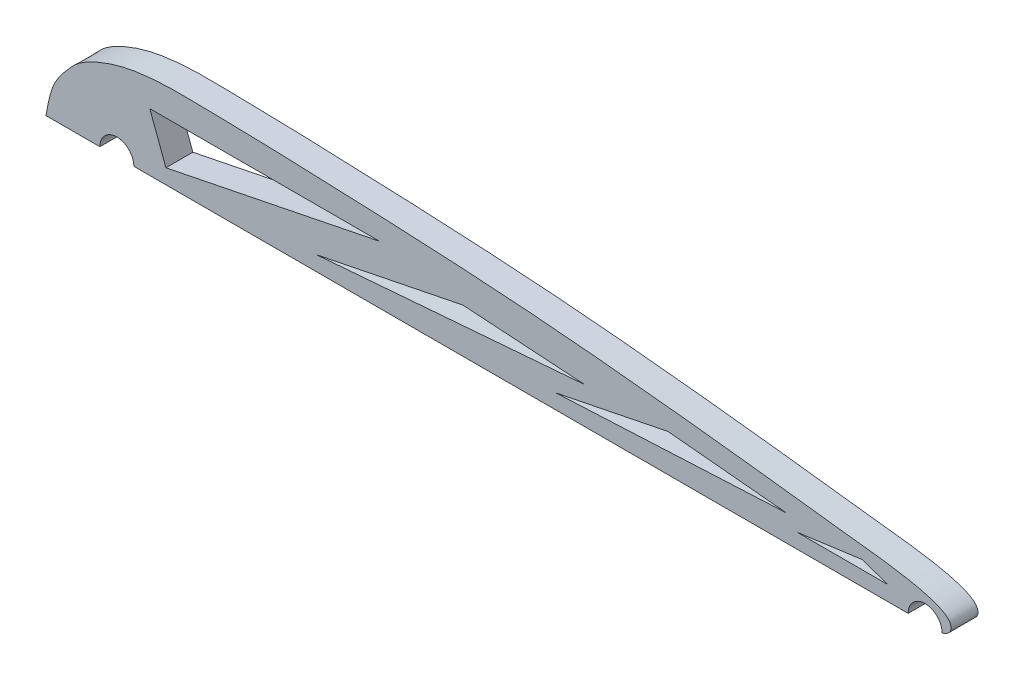
ISO-10303-21;
HEADER;
FILE_DESCRIPTION(('STEP AP214'),'2;1');
FILE_NAME('part.step','',(''),(''),'','','');
FILE_SCHEMA(('AUTOMOTIVE_DESIGN { 1 0 10303 214 1 1 1 1 }'));
ENDSEC;
DATA;
#1=APPLICATION_CONTEXT('core data for automotive mechanical design processes');
#2=APPLICATION_PROTOCOL_DEFINITION('international standard','automotive_design',2000,#1);
#3=PRODUCT_CONTEXT('',#1,'mechanical');
#4=PRODUCT('Part','Part','',(#3));
#5=PRODUCT_RELATED_PRODUCT_CATEGORY('part','',(#4));
#6=PRODUCT_DEFINITION_FORMATION('','',#4);
#7=PRODUCT_DEFINITION_CONTEXT('part definition',#1,'design');
#8=PRODUCT_DEFINITION('design','',#6,#7);
#9=PRODUCT_DEFINITION_SHAPE('','',#8);
#10=(LENGTH_UNIT() NAMED_UNIT(*) SI_UNIT(.MILLI.,.METRE.));
#11=(NAMED_UNIT(*) PLANE_ANGLE_UNIT() SI_UNIT($,.RADIAN.));
#12=(NAMED_UNIT(*) SI_UNIT($,.STERADIAN.) SOLID_ANGLE_UNIT());
#13=UNCERTAINTY_MEASURE_WITH_UNIT(LENGTH_MEASURE(1.E-05),#10,'distance_accuracy_value','');
#14=(GEOMETRIC_REPRESENTATION_CONTEXT(3) GLOBAL_UNCERTAINTY_ASSIGNED_CONTEXT((#13)) GLOBAL_UNIT_ASSIGNED_CONTEXT((#10,
#11,#12)) REPRESENTATION_CONTEXT('',''));
#15=CARTESIAN_POINT('',(0.,0.,0.));
#16=DIRECTION('',(0.,0.,1.));
#17=DIRECTION('',(1.,0.,0.));
#18=AXIS2_PLACEMENT_3D('',#15,#16,#17);
#19=CARTESIAN_POINT('',(14.8610356890417,12.1352375565523,5.));
#20=DIRECTION('',(0.,0.,1.));
#21=DIRECTION('',(1.,0.,0.));
#22=AXIS2_PLACEMENT_3D('',#19,#20,#21);
#23=PLANE('',#22);
#24=CARTESIAN_POINT('',(78.1499999999998,0.,5.));
#25=CARTESIAN_POINT('',(79.7288203575273,0.427224178476418,5.));
#26=CARTESIAN_POINT('',(81.3237199877719,4.87384359321941,5.));
#27=CARTESIAN_POINT('',(64.9906171257157,6.47003645683106,5.));
#28=CARTESIAN_POINT('',(42.9697577180014,9.06999575365193,5.));
#29=CARTESIAN_POINT('',(40.2082908404739,9.57389921274302,5.));
#30=CARTESIAN_POINT('',(10.4925086582751,12.6101721361199,5.));
#31=CARTESIAN_POINT('',(-10.4279332878798,14.3482725689576,5.));
#32=CARTESIAN_POINT('',(-48.1351279676736,15.7694257256182,5.));
#33=CARTESIAN_POINT('',(-61.1396803525049,15.8791381322763,5.));
#34=CARTESIAN_POINT('',(-66.8997810388126,16.2433251523578,5.));
#35=CARTESIAN_POINT('',(-75.9492736005043,14.6151501523316,5.));
#36=CARTESIAN_POINT('',(-81.5993452490482,12.2674547265709,5.));
#37=CARTESIAN_POINT('',(-86.1625850353552,7.09525795875279,5.));
#38=CARTESIAN_POINT('',(-87.2200022655602,5.73835966521686,5.));
#39=CARTESIAN_POINT('',(-88.15,0.,5.));
#40=B_SPLINE_CURVE_WITH_KNOTS('',3,(#24,#25,#26,#27,#28,#29,#30,#31,#32,#33,#34,#35,#36,#37,#38,
#39),.UNSPECIFIED.,.F.,.F.,(4,1,1,1,1,1,1,1,1,1,1,1,1,4),(0.,0.0583812049075519,
0.240524589126218,0.28476183635656,0.456516429980629,0.489994099803233,0.598069210379586,
0.698578605301512,0.721164247859249,0.812507703946103,0.830026929449823,0.878837277392729,
0.896444713797033,1.),.UNSPECIFIED.);
#41=CARTESIAN_POINT('',(78.15,0.,5.));
#42=VERTEX_POINT('',#41);
#43=CARTESIAN_POINT('',(-88.15,0.,5.));
#44=VERTEX_POINT('',#43);
#45=EDGE_CURVE('E251',#42,#44,#40,.T.);
#46=ORIENTED_EDGE('',*,*,#45,.T.);
#47=DIRECTION('',(1.,0.,0.));
#48=VECTOR('',#47,1.);
#49=CARTESIAN_POINT('',(-88.15,0.,5.));
#50=LINE('',#49,#48);
#51=CARTESIAN_POINT('',(-78.15,0.,5.));
#52=VERTEX_POINT('',#51);
#53=EDGE_CURVE('E257',#44,#52,#50,.T.);
#54=ORIENTED_EDGE('',*,*,#53,.T.);
#55=CARTESIAN_POINT('',(-75.,0.,5.));
#56=DIRECTION('',(0.,0.,-1.));
#57=DIRECTION('',(1.,0.,0.));
#58=AXIS2_PLACEMENT_3D('',#55,#56,#57);
#59=CIRCLE('',#58,3.15);
#60=CARTESIAN_POINT('',(-71.85,0.,5.));
#61=VERTEX_POINT('',#60);
#62=EDGE_CURVE('E263',#52,#61,#59,.T.);
#63=ORIENTED_EDGE('',*,*,#62,.T.);
#64=DIRECTION('',(1.,0.,0.));
#65=VECTOR('',#64,1.);
#66=CARTESIAN_POINT('',(-71.85,0.,5.));
#67=LINE('',#66,#65);
#68=CARTESIAN_POINT('',(71.85,0.,5.));
#69=VERTEX_POINT('',#68);
#70=EDGE_CURVE('E265',#61,#69,#67,.T.);
#71=ORIENTED_EDGE('',*,*,#70,.T.);
#72=CARTESIAN_POINT('',(75.,0.,5.));
#73=DIRECTION('',(0.,0.,-1.));
#74=DIRECTION('',(1.,0.,0.));
#75=AXIS2_PLACEMENT_3D('',#72,#73,#74);
#76=CIRCLE('',#75,3.15);
#77=EDGE_CURVE('E267',#69,#42,#76,.T.);
#78=ORIENTED_EDGE('',*,*,#77,.T.);
#79=EDGE_LOOP('',(#46,#54,#63,#71,#78));
#80=FACE_BOUND('',#79,.T.);
#81=DIRECTION('',(0.349847585913174,-0.936806632465166,0.));
#82=VECTOR('',#81,1.);
#83=CARTESIAN_POINT('',(-68.8935229566758,10.7598307033702,5.));
#84=LINE('',#83,#82);
#85=CARTESIAN_POINT('',(-68.8935229566758,10.7598307033702,5.));
#86=VERTEX_POINT('',#85);
#87=CARTESIAN_POINT('',(-65.8996184008828,2.7428834447127,5.));
#88=VERTEX_POINT('',#87);
#89=EDGE_CURVE('E230',#86,#88,#84,.T.);
#90=ORIENTED_EDGE('',*,*,#89,.F.);
#91=DIRECTION('',(-1.,0.,0.));
#92=VECTOR('',#91,1.);
#93=CARTESIAN_POINT('',(-26.2303830366254,10.7598307033702,5.));
#94=LINE('',#93,#92);
#95=CARTESIAN_POINT('',(-26.2303830366254,10.7598307033702,5.));
#96=VERTEX_POINT('',#95);
#97=EDGE_CURVE('E228',#96,#86,#94,.T.);
#98=ORIENTED_EDGE('',*,*,#97,.F.);
#99=DIRECTION('',(0.980183819704337,0.198090079483594,0.));
#100=VECTOR('',#99,1.);
#101=CARTESIAN_POINT('',(-65.8996184008828,2.7428834447127,5.));
#102=LINE('',#101,#100);
#103=EDGE_CURVE('E234',#88,#96,#102,.T.);
#104=ORIENTED_EDGE('',*,*,#103,.F.);
#105=EDGE_LOOP('',(#90,#98,#104));
#106=FACE_BOUND('',#105,.T.);
#107=DIRECTION('',(-0.99785604327123,0.0654470542277074,0.));
#108=VECTOR('',#107,1.);
#109=CARTESIAN_POINT('',(-10.7862147771477,8.2338593987021,5.));
#110=LINE('',#109,#108);
#111=CARTESIAN_POINT('',(11.8171540265773,6.75135707404146,5.));
#112=VERTEX_POINT('',#111);
#113=CARTESIAN_POINT('',(-10.7862147771477,8.2338593987021,5.));
#114=VERTEX_POINT('',#113);
#115=EDGE_CURVE('E206',#112,#114,#110,.T.);
#116=ORIENTED_EDGE('',*,*,#115,.F.);
#117=DIRECTION('',(0.996772824585682,0.0802741313717004,0.));
#118=VECTOR('',#117,1.);
#119=CARTESIAN_POINT('',(11.8171540265773,6.75135707404146,5.));
#120=LINE('',#119,#118);
#121=CARTESIAN_POINT('',(-37.9565092134814,2.7428834447127,5.));
#122=VERTEX_POINT('',#121);
#123=EDGE_CURVE('E204',#122,#112,#120,.T.);
#124=ORIENTED_EDGE('',*,*,#123,.F.);
#125=DIRECTION('',(-0.980183819704337,-0.198090079483594,0.));
#126=VECTOR('',#125,1.);
#127=CARTESIAN_POINT('',(-37.9565092134814,2.7428834447127,5.));
#128=LINE('',#127,#126);
#129=EDGE_CURVE('E210',#114,#122,#128,.T.);
#130=ORIENTED_EDGE('',*,*,#129,.F.);
#131=EDGE_LOOP('',(#116,#124,#130));
#132=FACE_BOUND('',#131,.T.);
#133=DIRECTION('',(-0.995451385128616,0.095270876166429,0.));
#134=VECTOR('',#133,1.);
#135=CARTESIAN_POINT('',(27.2662435771487,6.94911714167267,5.));
#136=LINE('',#135,#134);
#137=CARTESIAN_POINT('',(49.2409609739899,4.84600029319268,5.));
#138=VERTEX_POINT('',#137);
#139=CARTESIAN_POINT('',(27.2662435771487,6.94911714167267,5.));
#140=VERTEX_POINT('',#139);
#141=EDGE_CURVE('E182',#138,#140,#136,.T.);
#142=ORIENTED_EDGE('',*,*,#141,.F.);
#143=DIRECTION('',(0.998794217155936,0.0490928892596631,0.));
#144=VECTOR('',#143,1.);
#145=CARTESIAN_POINT('',(49.2409609739899,4.84600029319268,5.));
#146=LINE('',#145,#144);
#147=CARTESIAN_POINT('',(6.45307503078155,2.7428834447127,5.));
#148=VERTEX_POINT('',#147);
#149=EDGE_CURVE('E180',#148,#138,#146,.T.);
#150=ORIENTED_EDGE('',*,*,#149,.F.);
#151=DIRECTION('',(-0.980183819704337,-0.198090079483594,0.));
#152=VECTOR('',#151,1.);
#153=CARTESIAN_POINT('',(6.45307503078155,2.7428834447127,5.));
#154=LINE('',#153,#152);
#155=EDGE_CURVE('E186',#140,#148,#154,.T.);
#156=ORIENTED_EDGE('',*,*,#155,.F.);
#157=EDGE_LOOP('',(#142,#150,#156));
#158=FACE_BOUND('',#157,.T.);
#159=DIRECTION('',(-0.946331107992416,0.32319875316258,0.));
#160=VECTOR('',#159,1.);
#161=CARTESIAN_POINT('',(63.2976090040538,4.38617694027919,5.));
#162=LINE('',#161,#160);
#163=CARTESIAN_POINT('',(68.1091985884786,2.7428834447127,5.));
#164=VERTEX_POINT('',#163);
#165=CARTESIAN_POINT('',(63.2976090040538,4.38617694027919,5.));
#166=VERTEX_POINT('',#165);
#167=EDGE_CURVE('E161',#164,#166,#162,.T.);
#168=ORIENTED_EDGE('',*,*,#167,.F.);
#169=DIRECTION('',(1.,0.,0.));
#170=VECTOR('',#169,1.);
#171=CARTESIAN_POINT('',(68.1091985884786,2.7428834447127,5.));
#172=LINE('',#171,#170);
#173=CARTESIAN_POINT('',(51.2686350429916,2.7428834447127,5.));
#174=VERTEX_POINT('',#173);
#175=EDGE_CURVE('E153',#174,#164,#172,.T.);
#176=ORIENTED_EDGE('',*,*,#175,.F.);
#177=DIRECTION('',(-0.990797291137171,-0.135354083334207,0.));
#178=VECTOR('',#177,1.);
#179=CARTESIAN_POINT('',(51.2686350429916,2.7428834447127,5.));
#180=LINE('',#179,#178);
#181=EDGE_CURVE('E170',#166,#174,#180,.T.);
#182=ORIENTED_EDGE('',*,*,#181,.F.);
#183=EDGE_LOOP('',(#168,#176,#182));
#184=FACE_BOUND('',#183,.T.);
#185=ADVANCED_FACE('F33',(#80,#106,#132,#158,#184),#23,.T.);
#186=CARTESIAN_POINT('',(14.8610356890417,12.1352375565523,0.));
#187=DIRECTION('',(0.,0.,1.));
#188=DIRECTION('',(1.,0.,0.));
#189=AXIS2_PLACEMENT_3D('',#186,#187,#188);
#190=PLANE('',#189);
#191=DIRECTION('',(0.998794217155936,0.0490928892596631,0.));
#192=VECTOR('',#191,1.);
#193=CARTESIAN_POINT('',(49.2409609739899,4.84600029319268,0.));
#194=LINE('',#193,#192);
#195=CARTESIAN_POINT('',(6.45307503078155,2.7428834447127,0.));
#196=VERTEX_POINT('',#195);
#197=CARTESIAN_POINT('',(49.2409609739899,4.84600029319268,0.));
#198=VERTEX_POINT('',#197);
#199=EDGE_CURVE('E168',#196,#198,#194,.T.);
#200=ORIENTED_EDGE('',*,*,#199,.T.);
#201=DIRECTION('',(-0.995451385128616,0.095270876166429,0.));
#202=VECTOR('',#201,1.);
#203=CARTESIAN_POINT('',(27.2662435771487,6.94911714167267,0.));
#204=LINE('',#203,#202);
#205=CARTESIAN_POINT('',(27.2662435771487,6.94911714167267,0.));
#206=VERTEX_POINT('',#205);
#207=EDGE_CURVE('E191',#198,#206,#204,.T.);
#208=ORIENTED_EDGE('',*,*,#207,.T.);
#209=DIRECTION('',(-0.980183819704337,-0.198090079483594,0.));
#210=VECTOR('',#209,1.);
#211=CARTESIAN_POINT('',(6.45307503078155,2.7428834447127,0.));
#212=LINE('',#211,#210);
#213=EDGE_CURVE('E183',#206,#196,#212,.T.);
#214=ORIENTED_EDGE('',*,*,#213,.T.);
#215=EDGE_LOOP('',(#200,#208,#214));
#216=FACE_BOUND('',#215,.T.);
#217=DIRECTION('',(-1.,0.,0.));
#218=VECTOR('',#217,1.);
#219=CARTESIAN_POINT('',(-26.2303830366254,10.7598307033702,0.));
#220=LINE('',#219,#218);
#221=CARTESIAN_POINT('',(-26.2303830366254,10.7598307033702,0.));
#222=VERTEX_POINT('',#221);
#223=CARTESIAN_POINT('',(-68.8935229566758,10.7598307033702,0.));
#224=VERTEX_POINT('',#223);
#225=EDGE_CURVE('E227',#222,#224,#220,.T.);
#226=ORIENTED_EDGE('',*,*,#225,.T.);
#227=DIRECTION('',(0.349847585913174,-0.936806632465166,0.));
#228=VECTOR('',#227,1.);
#229=CARTESIAN_POINT('',(-68.8935229566758,10.7598307033702,0.));
#230=LINE('',#229,#228);
#231=CARTESIAN_POINT('',(-65.8996184008828,2.7428834447127,0.));
#232=VERTEX_POINT('',#231);
#233=EDGE_CURVE('E239',#224,#232,#230,.T.);
#234=ORIENTED_EDGE('',*,*,#233,.T.);
#235=DIRECTION('',(0.980183819704337,0.198090079483594,0.));
#236=VECTOR('',#235,1.);
#237=CARTESIAN_POINT('',(-65.8996184008828,2.7428834447127,0.));
#238=LINE('',#237,#236);
#239=EDGE_CURVE('E231',#232,#222,#238,.T.);
#240=ORIENTED_EDGE('',*,*,#239,.T.);
#241=EDGE_LOOP('',(#226,#234,#240));
#242=FACE_BOUND('',#241,.T.);
#243=CARTESIAN_POINT('',(78.1499999999998,0.,0.));
#244=CARTESIAN_POINT('',(79.7288203575273,0.427224178476418,0.));
#245=CARTESIAN_POINT('',(81.3237199877719,4.87384359321941,0.));
#246=CARTESIAN_POINT('',(64.9906171257157,6.47003645683106,0.));
#247=CARTESIAN_POINT('',(42.9697577180014,9.06999575365193,0.));
#248=CARTESIAN_POINT('',(40.2082908404739,9.57389921274302,0.));
#249=CARTESIAN_POINT('',(10.4925086582751,12.6101721361199,0.));
#250=CARTESIAN_POINT('',(-10.4279332878798,14.3482725689576,0.));
#251=CARTESIAN_POINT('',(-48.1351279676736,15.7694257256182,0.));
#252=CARTESIAN_POINT('',(-61.1396803525049,15.8791381322763,0.));
#253=CARTESIAN_POINT('',(-66.8997810388126,16.2433251523578,0.));
#254=CARTESIAN_POINT('',(-75.9492736005043,14.6151501523316,0.));
#255=CARTESIAN_POINT('',(-81.5993452490482,12.2674547265709,0.));
#256=CARTESIAN_POINT('',(-86.1625850353552,7.09525795875279,0.));
#257=CARTESIAN_POINT('',(-87.2200022655602,5.73835966521686,0.));
#258=CARTESIAN_POINT('',(-88.15,0.,0.));
#259=B_SPLINE_CURVE_WITH_KNOTS('',3,(#243,#244,#245,#246,#247,#248,#249,#250,#251,#252,#253,
#254,#255,#256,#257,#258),.UNSPECIFIED.,.F.,.F.,(4,1,1,1,1,1,1,1,1,1,1,1,1,4),(0.,
0.0583812049075519,0.240524589126218,0.28476183635656,0.456516429980629,0.489994099803233,
0.598069210379586,0.698578605301512,0.721164247859249,0.812507703946103,0.830026929449823,
0.878837277392729,0.896444713797033,1.),.UNSPECIFIED.);
#260=CARTESIAN_POINT('',(78.15,0.,0.));
#261=VERTEX_POINT('',#260);
#262=CARTESIAN_POINT('',(-88.15,0.,0.));
#263=VERTEX_POINT('',#262);
#264=EDGE_CURVE('E250',#261,#263,#259,.T.);
#265=ORIENTED_EDGE('',*,*,#264,.F.);
#266=CARTESIAN_POINT('',(75.,0.,0.));
#267=DIRECTION('',(0.,0.,-1.));
#268=DIRECTION('',(1.,0.,0.));
#269=AXIS2_PLACEMENT_3D('',#266,#267,#268);
#270=CIRCLE('',#269,3.15);
#271=CARTESIAN_POINT('',(71.85,0.,0.));
#272=VERTEX_POINT('',#271);
#273=EDGE_CURVE('E258',#272,#261,#270,.T.);
#274=ORIENTED_EDGE('',*,*,#273,.F.);
#275=DIRECTION('',(1.,0.,0.));
#276=VECTOR('',#275,1.);
#277=CARTESIAN_POINT('',(-71.85,0.,0.));
#278=LINE('',#277,#276);
#279=CARTESIAN_POINT('',(-71.85,0.,0.));
#280=VERTEX_POINT('',#279);
#281=EDGE_CURVE('E281',#280,#272,#278,.T.);
#282=ORIENTED_EDGE('',*,*,#281,.F.);
#283=CARTESIAN_POINT('',(-75.,0.,0.));
#284=DIRECTION('',(0.,0.,-1.));
#285=DIRECTION('',(1.,0.,0.));
#286=AXIS2_PLACEMENT_3D('',#283,#284,#285);
#287=CIRCLE('',#286,3.15);
#288=CARTESIAN_POINT('',(-78.15,0.,0.));
#289=VERTEX_POINT('',#288);
#290=EDGE_CURVE('E279',#289,#280,#287,.T.);
#291=ORIENTED_EDGE('',*,*,#290,.F.);
#292=DIRECTION('',(1.,0.,0.));
#293=VECTOR('',#292,1.);
#294=CARTESIAN_POINT('',(-88.15,0.,0.));
#295=LINE('',#294,#293);
#296=EDGE_CURVE('E274',#263,#289,#295,.T.);
#297=ORIENTED_EDGE('',*,*,#296,.F.);
#298=EDGE_LOOP('',(#265,#274,#282,#291,#297));
#299=FACE_BOUND('',#298,.T.);
#300=DIRECTION('',(0.996772824585682,0.0802741313717004,0.));
#301=VECTOR('',#300,1.);
#302=CARTESIAN_POINT('',(11.8171540265773,6.75135707404146,0.));
#303=LINE('',#302,#301);
#304=CARTESIAN_POINT('',(-37.9565092134814,2.7428834447127,0.));
#305=VERTEX_POINT('',#304);
#306=CARTESIAN_POINT('',(11.8171540265773,6.75135707404146,0.));
#307=VERTEX_POINT('',#306);
#308=EDGE_CURVE('E203',#305,#307,#303,.T.);
#309=ORIENTED_EDGE('',*,*,#308,.T.);
#310=DIRECTION('',(-0.99785604327123,0.0654470542277074,0.));
#311=VECTOR('',#310,1.);
#312=CARTESIAN_POINT('',(-10.7862147771477,8.2338593987021,0.));
#313=LINE('',#312,#311);
#314=CARTESIAN_POINT('',(-10.7862147771477,8.2338593987021,0.));
#315=VERTEX_POINT('',#314);
#316=EDGE_CURVE('E215',#307,#315,#313,.T.);
#317=ORIENTED_EDGE('',*,*,#316,.T.);
#318=DIRECTION('',(-0.980183819704337,-0.198090079483594,0.));
#319=VECTOR('',#318,1.);
#320=CARTESIAN_POINT('',(-37.9565092134814,2.7428834447127,0.));
#321=LINE('',#320,#319);
#322=EDGE_CURVE('E207',#315,#305,#321,.T.);
#323=ORIENTED_EDGE('',*,*,#322,.T.);
#324=EDGE_LOOP('',(#309,#317,#323));
#325=FACE_BOUND('',#324,.T.);
#326=DIRECTION('',(1.,0.,0.));
#327=VECTOR('',#326,1.);
#328=CARTESIAN_POINT('',(68.1091985884786,2.7428834447127,0.));
#329=LINE('',#328,#327);
#330=CARTESIAN_POINT('',(51.2686350429916,2.7428834447127,0.));
#331=VERTEX_POINT('',#330);
#332=CARTESIAN_POINT('',(68.1091985884786,2.7428834447127,0.));
#333=VERTEX_POINT('',#332);
#334=EDGE_CURVE('E57',#331,#333,#329,.T.);
#335=ORIENTED_EDGE('',*,*,#334,.T.);
#336=DIRECTION('',(-0.946331107992416,0.32319875316258,0.));
#337=VECTOR('',#336,1.);
#338=CARTESIAN_POINT('',(63.2976090040538,4.38617694027919,0.));
#339=LINE('',#338,#337);
#340=CARTESIAN_POINT('',(63.2976090040538,4.38617694027919,0.));
#341=VERTEX_POINT('',#340);
#342=EDGE_CURVE('E167',#333,#341,#339,.T.);
#343=ORIENTED_EDGE('',*,*,#342,.T.);
#344=DIRECTION('',(-0.990797291137171,-0.135354083334207,0.));
#345=VECTOR('',#344,1.);
#346=CARTESIAN_POINT('',(51.2686350429916,2.7428834447127,0.));
#347=LINE('',#346,#345);
#348=EDGE_CURVE('E162',#341,#331,#347,.T.);
#349=ORIENTED_EDGE('',*,*,#348,.T.);
#350=EDGE_LOOP('',(#335,#343,#349));
#351=FACE_BOUND('',#350,.T.);
#352=ADVANCED_FACE('F302',(#216,#242,#299,#325,#351),#190,.F.);
#353=DIRECTION('',(0.,0.,-1.));
#354=VECTOR('',#353,1.);
#355=SURFACE_OF_LINEAR_EXTRUSION('',#40,#354);
#356=ORIENTED_EDGE('',*,*,#264,.T.);
#357=DIRECTION('',(0.,0.,-1.));
#358=VECTOR('',#357,1.);
#359=CARTESIAN_POINT('',(-88.15,0.,5.));
#360=LINE('',#359,#358);
#361=EDGE_CURVE('E11',#44,#263,#360,.T.);
#362=ORIENTED_EDGE('',*,*,#361,.F.);
#363=ORIENTED_EDGE('',*,*,#45,.F.);
#364=DIRECTION('',(0.,0.,-1.));
#365=VECTOR('',#364,1.);
#366=CARTESIAN_POINT('',(78.15,0.,5.));
#367=LINE('',#366,#365);
#368=EDGE_CURVE('E269',#42,#261,#367,.T.);
#369=ORIENTED_EDGE('',*,*,#368,.T.);
#370=EDGE_LOOP('',(#356,#362,#363,#369));
#371=FACE_BOUND('',#370,.T.);
#372=ADVANCED_FACE('F35',(#371),#355,.F.);
#373=CARTESIAN_POINT('',(-88.15,0.,5.));
#374=DIRECTION('',(0.,1.,0.));
#375=DIRECTION('',(0.,0.,1.));
#376=AXIS2_PLACEMENT_3D('',#373,#374,#375);
#377=PLANE('',#376);
#378=ORIENTED_EDGE('',*,*,#296,.T.);
#379=DIRECTION('',(0.,0.,-1.));
#380=VECTOR('',#379,1.);
#381=CARTESIAN_POINT('',(-78.15,0.,5.));
#382=LINE('',#381,#380);
#383=EDGE_CURVE('E42',#52,#289,#382,.T.);
#384=ORIENTED_EDGE('',*,*,#383,.F.);
#385=ORIENTED_EDGE('',*,*,#53,.F.);
#386=ORIENTED_EDGE('',*,*,#361,.T.);
#387=EDGE_LOOP('',(#378,#384,#385,#386));
#388=FACE_BOUND('',#387,.T.);
#389=ADVANCED_FACE('F317',(#388),#377,.F.);
#390=CARTESIAN_POINT('',(-75.,0.,5.));
#391=DIRECTION('',(0.,0.,-1.));
#392=DIRECTION('',(-1.,0.,0.));
#393=AXIS2_PLACEMENT_3D('',#390,#391,#392);
#394=CYLINDRICAL_SURFACE('',#393,3.15);
#395=ORIENTED_EDGE('',*,*,#290,.T.);
#396=DIRECTION('',(0.,0.,-1.));
#397=VECTOR('',#396,1.);
#398=CARTESIAN_POINT('',(-71.85,0.,5.));
#399=LINE('',#398,#397);
#400=EDGE_CURVE('E289',#61,#280,#399,.T.);
#401=ORIENTED_EDGE('',*,*,#400,.F.);
#402=ORIENTED_EDGE('',*,*,#62,.F.);
#403=ORIENTED_EDGE('',*,*,#383,.T.);
#404=EDGE_LOOP('',(#395,#401,#402,#403));
#405=FACE_BOUND('',#404,.T.);
#406=ADVANCED_FACE('F296',(#405),#394,.F.);
#407=CARTESIAN_POINT('',(-71.85,0.,5.));
#408=DIRECTION('',(0.,1.,0.));
#409=DIRECTION('',(0.,0.,1.));
#410=AXIS2_PLACEMENT_3D('',#407,#408,#409);
#411=PLANE('',#410);
#412=ORIENTED_EDGE('',*,*,#281,.T.);
#413=DIRECTION('',(0.,0.,-1.));
#414=VECTOR('',#413,1.);
#415=CARTESIAN_POINT('',(71.85,0.,5.));
#416=LINE('',#415,#414);
#417=EDGE_CURVE('E286',#69,#272,#416,.T.);
#418=ORIENTED_EDGE('',*,*,#417,.F.);
#419=ORIENTED_EDGE('',*,*,#70,.F.);
#420=ORIENTED_EDGE('',*,*,#400,.T.);
#421=EDGE_LOOP('',(#412,#418,#419,#420));
#422=FACE_BOUND('',#421,.T.);
#423=ADVANCED_FACE('F307',(#422),#411,.F.);
#424=CARTESIAN_POINT('',(75.,0.,5.));
#425=DIRECTION('',(0.,0.,-1.));
#426=DIRECTION('',(-1.,0.,0.));
#427=AXIS2_PLACEMENT_3D('',#424,#425,#426);
#428=CYLINDRICAL_SURFACE('',#427,3.15);
#429=ORIENTED_EDGE('',*,*,#273,.T.);
#430=ORIENTED_EDGE('',*,*,#368,.F.);
#431=ORIENTED_EDGE('',*,*,#77,.F.);
#432=ORIENTED_EDGE('',*,*,#417,.T.);
#433=EDGE_LOOP('',(#429,#430,#431,#432));
#434=FACE_BOUND('',#433,.T.);
#435=ADVANCED_FACE('F311',(#434),#428,.F.);
#436=CARTESIAN_POINT('',(-26.2303830366254,10.7598307033702,5.));
#437=DIRECTION('',(0.,-1.,0.));
#438=DIRECTION('',(0.,0.,-1.));
#439=AXIS2_PLACEMENT_3D('',#436,#437,#438);
#440=PLANE('',#439);
#441=ORIENTED_EDGE('',*,*,#225,.F.);
#442=DIRECTION('',(0.,0.,-1.));
#443=VECTOR('',#442,1.);
#444=CARTESIAN_POINT('',(-26.2303830366254,10.7598307033702,5.));
#445=LINE('',#444,#443);
#446=EDGE_CURVE('E236',#96,#222,#445,.T.);
#447=ORIENTED_EDGE('',*,*,#446,.F.);
#448=ORIENTED_EDGE('',*,*,#97,.T.);
#449=DIRECTION('',(0.,0.,-1.));
#450=VECTOR('',#449,1.);
#451=CARTESIAN_POINT('',(-68.8935229566758,10.7598307033702,5.));
#452=LINE('',#451,#450);
#453=EDGE_CURVE('E248',#86,#224,#452,.T.);
#454=ORIENTED_EDGE('',*,*,#453,.T.);
#455=EDGE_LOOP('',(#441,#447,#448,#454));
#456=FACE_BOUND('',#455,.T.);
#457=ADVANCED_FACE('F331',(#456),#440,.T.);
#458=CARTESIAN_POINT('',(-68.8935229566758,10.7598307033702,5.));
#459=DIRECTION('',(0.936806632465166,0.349847585913174,0.));
#460=DIRECTION('',(-0.349847585913174,0.936806632465166,0.));
#461=AXIS2_PLACEMENT_3D('',#458,#459,#460);
#462=PLANE('',#461);
#463=ORIENTED_EDGE('',*,*,#233,.F.);
#464=ORIENTED_EDGE('',*,*,#453,.F.);
#465=ORIENTED_EDGE('',*,*,#89,.T.);
#466=DIRECTION('',(0.,0.,-1.));
#467=VECTOR('',#466,1.);
#468=CARTESIAN_POINT('',(-65.8996184008828,2.7428834447127,5.));
#469=LINE('',#468,#467);
#470=EDGE_CURVE('E246',#88,#232,#469,.T.);
#471=ORIENTED_EDGE('',*,*,#470,.T.);
#472=EDGE_LOOP('',(#463,#464,#465,#471));
#473=FACE_BOUND('',#472,.T.);
#474=ADVANCED_FACE('F357',(#473),#462,.T.);
#475=CARTESIAN_POINT('',(-65.8996184008828,2.7428834447127,5.));
#476=DIRECTION('',(-0.198090079483594,0.980183819704337,0.));
#477=DIRECTION('',(-0.980183819704337,-0.198090079483594,0.));
#478=AXIS2_PLACEMENT_3D('',#475,#476,#477);
#479=PLANE('',#478);
#480=ORIENTED_EDGE('',*,*,#239,.F.);
#481=ORIENTED_EDGE('',*,*,#470,.F.);
#482=ORIENTED_EDGE('',*,*,#103,.T.);
#483=ORIENTED_EDGE('',*,*,#446,.T.);
#484=EDGE_LOOP('',(#480,#481,#482,#483));
#485=FACE_BOUND('',#484,.T.);
#486=ADVANCED_FACE('F364',(#485),#479,.T.);
#487=CARTESIAN_POINT('',(11.8171540265773,6.75135707404146,5.));
#488=DIRECTION('',(-0.0802741313717004,0.996772824585682,0.));
#489=DIRECTION('',(-0.996772824585682,-0.0802741313717004,0.));
#490=AXIS2_PLACEMENT_3D('',#487,#488,#489);
#491=PLANE('',#490);
#492=ORIENTED_EDGE('',*,*,#308,.F.);
#493=DIRECTION('',(0.,0.,-1.));
#494=VECTOR('',#493,1.);
#495=CARTESIAN_POINT('',(-37.9565092134814,2.7428834447127,5.));
#496=LINE('',#495,#494);
#497=EDGE_CURVE('E212',#122,#305,#496,.T.);
#498=ORIENTED_EDGE('',*,*,#497,.F.);
#499=ORIENTED_EDGE('',*,*,#123,.T.);
#500=DIRECTION('',(0.,0.,-1.));
#501=VECTOR('',#500,1.);
#502=CARTESIAN_POINT('',(11.8171540265773,6.75135707404146,5.));
#503=LINE('',#502,#501);
#504=EDGE_CURVE('E224',#112,#307,#503,.T.);
#505=ORIENTED_EDGE('',*,*,#504,.T.);
#506=EDGE_LOOP('',(#492,#498,#499,#505));
#507=FACE_BOUND('',#506,.T.);
#508=ADVANCED_FACE('F371',(#507),#491,.T.);
#509=CARTESIAN_POINT('',(-10.7862147771477,8.2338593987021,5.));
#510=DIRECTION('',(-0.0654470542277074,-0.99785604327123,0.));
#511=DIRECTION('',(0.99785604327123,-0.0654470542277074,0.));
#512=AXIS2_PLACEMENT_3D('',#509,#510,#511);
#513=PLANE('',#512);
#514=ORIENTED_EDGE('',*,*,#316,.F.);
#515=ORIENTED_EDGE('',*,*,#504,.F.);
#516=ORIENTED_EDGE('',*,*,#115,.T.);
#517=DIRECTION('',(0.,0.,-1.));
#518=VECTOR('',#517,1.);
#519=CARTESIAN_POINT('',(-10.7862147771477,8.2338593987021,5.));
#520=LINE('',#519,#518);
#521=EDGE_CURVE('E222',#114,#315,#520,.T.);
#522=ORIENTED_EDGE('',*,*,#521,.T.);
#523=EDGE_LOOP('',(#514,#515,#516,#522));
#524=FACE_BOUND('',#523,.T.);
#525=ADVANCED_FACE('F379',(#524),#513,.T.);
#526=CARTESIAN_POINT('',(-37.9565092134814,2.7428834447127,5.));
#527=DIRECTION('',(0.198090079483594,-0.980183819704337,0.));
#528=DIRECTION('',(0.980183819704337,0.198090079483594,0.));
#529=AXIS2_PLACEMENT_3D('',#526,#527,#528);
#530=PLANE('',#529);
#531=ORIENTED_EDGE('',*,*,#322,.F.);
#532=ORIENTED_EDGE('',*,*,#521,.F.);
#533=ORIENTED_EDGE('',*,*,#129,.T.);
#534=ORIENTED_EDGE('',*,*,#497,.T.);
#535=EDGE_LOOP('',(#531,#532,#533,#534));
#536=FACE_BOUND('',#535,.T.);
#537=ADVANCED_FACE('F387',(#536),#530,.T.);
#538=CARTESIAN_POINT('',(49.2409609739899,4.84600029319268,5.));
#539=DIRECTION('',(-0.0490928892596631,0.998794217155936,0.));
#540=DIRECTION('',(-0.998794217155936,-0.0490928892596631,0.));
#541=AXIS2_PLACEMENT_3D('',#538,#539,#540);
#542=PLANE('',#541);
#543=ORIENTED_EDGE('',*,*,#199,.F.);
#544=DIRECTION('',(0.,0.,-1.));
#545=VECTOR('',#544,1.);
#546=CARTESIAN_POINT('',(6.45307503078155,2.7428834447127,5.));
#547=LINE('',#546,#545);
#548=EDGE_CURVE('E188',#148,#196,#547,.T.);
#549=ORIENTED_EDGE('',*,*,#548,.F.);
#550=ORIENTED_EDGE('',*,*,#149,.T.);
#551=DIRECTION('',(0.,0.,-1.));
#552=VECTOR('',#551,1.);
#553=CARTESIAN_POINT('',(49.2409609739899,4.84600029319268,5.));
#554=LINE('',#553,#552);
#555=EDGE_CURVE('E200',#138,#198,#554,.T.);
#556=ORIENTED_EDGE('',*,*,#555,.T.);
#557=EDGE_LOOP('',(#543,#549,#550,#556));
#558=FACE_BOUND('',#557,.T.);
#559=ADVANCED_FACE('F395',(#558),#542,.T.);
#560=CARTESIAN_POINT('',(27.2662435771487,6.94911714167267,5.));
#561=DIRECTION('',(-0.095270876166429,-0.995451385128616,0.));
#562=DIRECTION('',(0.995451385128616,-0.095270876166429,0.));
#563=AXIS2_PLACEMENT_3D('',#560,#561,#562);
#564=PLANE('',#563);
#565=ORIENTED_EDGE('',*,*,#207,.F.);
#566=ORIENTED_EDGE('',*,*,#555,.F.);
#567=ORIENTED_EDGE('',*,*,#141,.T.);
#568=DIRECTION('',(0.,0.,-1.));
#569=VECTOR('',#568,1.);
#570=CARTESIAN_POINT('',(27.2662435771487,6.94911714167267,5.));
#571=LINE('',#570,#569);
#572=EDGE_CURVE('E198',#140,#206,#571,.T.);
#573=ORIENTED_EDGE('',*,*,#572,.T.);
#574=EDGE_LOOP('',(#565,#566,#567,#573));
#575=FACE_BOUND('',#574,.T.);
#576=ADVANCED_FACE('F403',(#575),#564,.T.);
#577=CARTESIAN_POINT('',(6.45307503078155,2.7428834447127,5.));
#578=DIRECTION('',(0.198090079483594,-0.980183819704337,0.));
#579=DIRECTION('',(0.980183819704337,0.198090079483594,0.));
#580=AXIS2_PLACEMENT_3D('',#577,#578,#579);
#581=PLANE('',#580);
#582=ORIENTED_EDGE('',*,*,#213,.F.);
#583=ORIENTED_EDGE('',*,*,#572,.F.);
#584=ORIENTED_EDGE('',*,*,#155,.T.);
#585=ORIENTED_EDGE('',*,*,#548,.T.);
#586=EDGE_LOOP('',(#582,#583,#584,#585));
#587=FACE_BOUND('',#586,.T.);
#588=ADVANCED_FACE('F411',(#587),#581,.T.);
#589=CARTESIAN_POINT('',(68.1091985884786,2.7428834447127,5.));
#590=DIRECTION('',(0.,1.,0.));
#591=DIRECTION('',(0.,0.,1.));
#592=AXIS2_PLACEMENT_3D('',#589,#590,#591);
#593=PLANE('',#592);
#594=ORIENTED_EDGE('',*,*,#334,.F.);
#595=DIRECTION('',(0.,0.,-1.));
#596=VECTOR('',#595,1.);
#597=CARTESIAN_POINT('',(51.2686350429916,2.7428834447127,5.));
#598=LINE('',#597,#596);
#599=EDGE_CURVE('E157',#174,#331,#598,.T.);
#600=ORIENTED_EDGE('',*,*,#599,.F.);
#601=ORIENTED_EDGE('',*,*,#175,.T.);
#602=DIRECTION('',(0.,0.,-1.));
#603=VECTOR('',#602,1.);
#604=CARTESIAN_POINT('',(68.1091985884786,2.7428834447127,5.));
#605=LINE('',#604,#603);
#606=EDGE_CURVE('E156',#164,#333,#605,.T.);
#607=ORIENTED_EDGE('',*,*,#606,.T.);
#608=EDGE_LOOP('',(#594,#600,#601,#607));
#609=FACE_BOUND('',#608,.T.);
#610=ADVANCED_FACE('F155',(#609),#593,.T.);
#611=CARTESIAN_POINT('',(63.2976090040538,4.38617694027919,5.));
#612=DIRECTION('',(-0.32319875316258,-0.946331107992416,0.));
#613=DIRECTION('',(0.946331107992416,-0.32319875316258,0.));
#614=AXIS2_PLACEMENT_3D('',#611,#612,#613);
#615=PLANE('',#614);
#616=ORIENTED_EDGE('',*,*,#342,.F.);
#617=ORIENTED_EDGE('',*,*,#606,.F.);
#618=ORIENTED_EDGE('',*,*,#167,.T.);
#619=DIRECTION('',(0.,0.,-1.));
#620=VECTOR('',#619,1.);
#621=CARTESIAN_POINT('',(63.2976090040538,4.38617694027919,5.));
#622=LINE('',#621,#620);
#623=EDGE_CURVE('E49',#166,#341,#622,.T.);
#624=ORIENTED_EDGE('',*,*,#623,.T.);
#625=EDGE_LOOP('',(#616,#617,#618,#624));
#626=FACE_BOUND('',#625,.T.);
#627=ADVANCED_FACE('F165',(#626),#615,.T.);
#628=CARTESIAN_POINT('',(51.2686350429916,2.7428834447127,5.));
#629=DIRECTION('',(0.135354083334207,-0.990797291137171,0.));
#630=DIRECTION('',(0.990797291137171,0.135354083334207,0.));
#631=AXIS2_PLACEMENT_3D('',#628,#629,#630);
#632=PLANE('',#631);
#633=ORIENTED_EDGE('',*,*,#348,.F.);
#634=ORIENTED_EDGE('',*,*,#623,.F.);
#635=ORIENTED_EDGE('',*,*,#181,.T.);
#636=ORIENTED_EDGE('',*,*,#599,.T.);
#637=EDGE_LOOP('',(#633,#634,#635,#636));
#638=FACE_BOUND('',#637,.T.);
#639=ADVANCED_FACE('F432',(#638),#632,.T.);
#640=CLOSED_SHELL('',(#185,#352,#372,#389,#406,#423,#435,#457,#474,#486,#508,#525,#537,#559,
#576,#588,#610,#627,#639));
#641=MANIFOLD_SOLID_BREP('B2',#640);
#642=ADVANCED_BREP_SHAPE_REPRESENTATION('',(#18,#641),#14);
#643=SHAPE_DEFINITION_REPRESENTATION(#9,#642);
ENDSEC;
END-ISO-10303-21;
